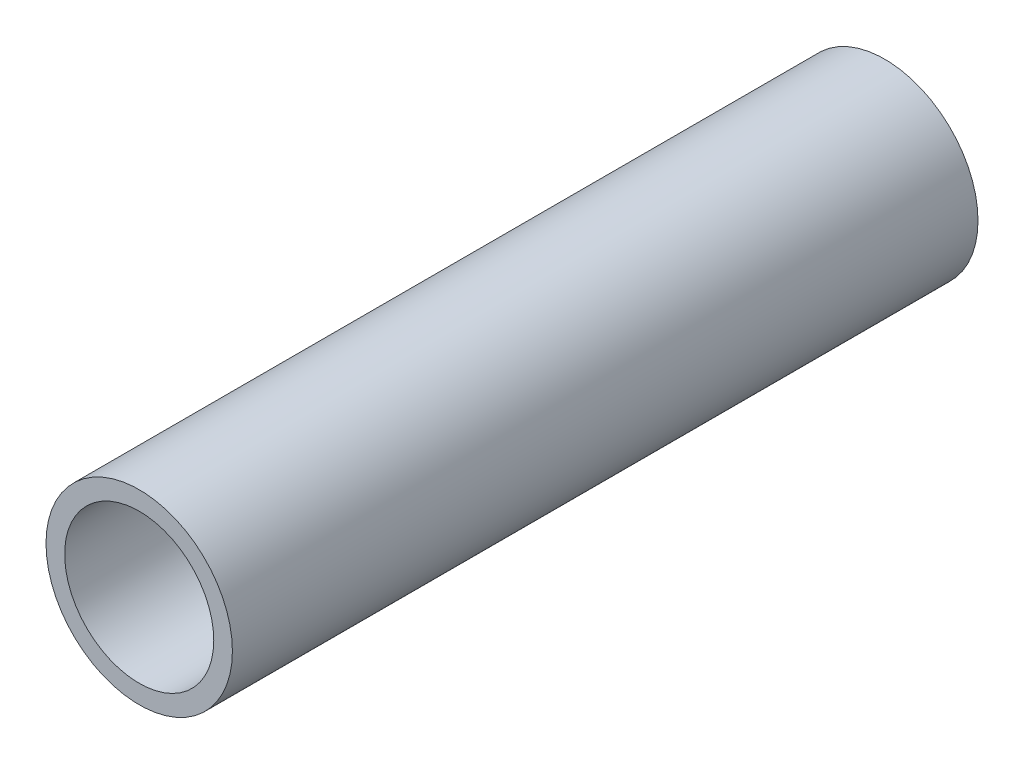
ISO-10303-21;
HEADER;
FILE_DESCRIPTION(('STEP AP214'),'2;1');
FILE_NAME('part.step','',(''),(''),'','','');
FILE_SCHEMA(('AUTOMOTIVE_DESIGN { 1 0 10303 214 1 1 1 1 }'));
ENDSEC;
DATA;
#1=APPLICATION_CONTEXT('core data for automotive mechanical design processes');
#2=APPLICATION_PROTOCOL_DEFINITION('international standard','automotive_design',2000,#1);
#3=PRODUCT_CONTEXT('',#1,'mechanical');
#4=PRODUCT('Part','Part','',(#3));
#5=PRODUCT_RELATED_PRODUCT_CATEGORY('part','',(#4));
#6=PRODUCT_DEFINITION_FORMATION('','',#4);
#7=PRODUCT_DEFINITION_CONTEXT('part definition',#1,'design');
#8=PRODUCT_DEFINITION('design','',#6,#7);
#9=PRODUCT_DEFINITION_SHAPE('','',#8);
#10=(LENGTH_UNIT() NAMED_UNIT(*) SI_UNIT(.MILLI.,.METRE.));
#11=(NAMED_UNIT(*) PLANE_ANGLE_UNIT() SI_UNIT($,.RADIAN.));
#12=(NAMED_UNIT(*) SI_UNIT($,.STERADIAN.) SOLID_ANGLE_UNIT());
#13=UNCERTAINTY_MEASURE_WITH_UNIT(LENGTH_MEASURE(1.E-05),#10,'distance_accuracy_value','');
#14=(GEOMETRIC_REPRESENTATION_CONTEXT(3) GLOBAL_UNCERTAINTY_ASSIGNED_CONTEXT((#13)) GLOBAL_UNIT_ASSIGNED_CONTEXT((#10,
#11,#12)) REPRESENTATION_CONTEXT('',''));
#15=CARTESIAN_POINT('',(0.,0.,0.));
#16=DIRECTION('',(0.,0.,1.));
#17=DIRECTION('',(1.,0.,0.));
#18=AXIS2_PLACEMENT_3D('',#15,#16,#17);
#19=CARTESIAN_POINT('',(0.,0.,40.));
#20=DIRECTION('',(0.,0.,1.));
#21=DIRECTION('',(1.,0.,0.));
#22=AXIS2_PLACEMENT_3D('',#19,#20,#21);
#23=PLANE('',#22);
#24=CARTESIAN_POINT('',(0.,0.,40.));
#25=DIRECTION('',(0.,0.,1.));
#26=DIRECTION('',(1.,0.,0.));
#27=AXIS2_PLACEMENT_3D('',#24,#25,#26);
#28=CIRCLE('',#27,5.);
#29=CARTESIAN_POINT('',(5.,0.,40.));
#30=VERTEX_POINT('',#29);
#31=EDGE_CURVE('E10',#30,#30,#28,.T.);
#32=ORIENTED_EDGE('',*,*,#31,.T.);
#33=EDGE_LOOP('',(#32));
#34=FACE_BOUND('',#33,.T.);
#35=CARTESIAN_POINT('',(0.,0.,40.));
#36=DIRECTION('',(0.,0.,1.));
#37=DIRECTION('',(1.,0.,0.));
#38=AXIS2_PLACEMENT_3D('',#35,#36,#37);
#39=CIRCLE('',#38,4.);
#40=CARTESIAN_POINT('',(4.,0.,40.));
#41=VERTEX_POINT('',#40);
#42=EDGE_CURVE('E42',#41,#41,#39,.T.);
#43=ORIENTED_EDGE('',*,*,#42,.F.);
#44=EDGE_LOOP('',(#43));
#45=FACE_BOUND('',#44,.T.);
#46=ADVANCED_FACE('F31',(#34,#45),#23,.T.);
#47=CARTESIAN_POINT('',(0.,0.,0.));
#48=DIRECTION('',(0.,0.,1.));
#49=DIRECTION('',(1.,0.,0.));
#50=AXIS2_PLACEMENT_3D('',#47,#48,#49);
#51=PLANE('',#50);
#52=CARTESIAN_POINT('',(0.,0.,0.));
#53=DIRECTION('',(0.,0.,1.));
#54=DIRECTION('',(1.,0.,0.));
#55=AXIS2_PLACEMENT_3D('',#52,#53,#54);
#56=CIRCLE('',#55,5.);
#57=CARTESIAN_POINT('',(5.,0.,0.));
#58=VERTEX_POINT('',#57);
#59=EDGE_CURVE('E35',#58,#58,#56,.T.);
#60=ORIENTED_EDGE('',*,*,#59,.F.);
#61=EDGE_LOOP('',(#60));
#62=FACE_BOUND('',#61,.T.);
#63=CARTESIAN_POINT('',(0.,0.,0.));
#64=DIRECTION('',(0.,0.,1.));
#65=DIRECTION('',(1.,0.,0.));
#66=AXIS2_PLACEMENT_3D('',#63,#64,#65);
#67=CIRCLE('',#66,4.);
#68=CARTESIAN_POINT('',(4.,0.,0.));
#69=VERTEX_POINT('',#68);
#70=EDGE_CURVE('E44',#69,#69,#67,.T.);
#71=ORIENTED_EDGE('',*,*,#70,.T.);
#72=EDGE_LOOP('',(#71));
#73=FACE_BOUND('',#72,.T.);
#74=ADVANCED_FACE('F54',(#62,#73),#51,.F.);
#75=CARTESIAN_POINT('',(0.,0.,40.));
#76=DIRECTION('',(0.,0.,-1.));
#77=DIRECTION('',(-1.,0.,0.));
#78=AXIS2_PLACEMENT_3D('',#75,#76,#77);
#79=CYLINDRICAL_SURFACE('',#78,5.);
#80=ORIENTED_EDGE('',*,*,#31,.F.);
#81=EDGE_LOOP('',(#80));
#82=FACE_BOUND('',#81,.T.);
#83=ORIENTED_EDGE('',*,*,#59,.T.);
#84=EDGE_LOOP('',(#83));
#85=FACE_BOUND('',#84,.T.);
#86=ADVANCED_FACE('F33',(#82,#85),#79,.T.);
#87=CARTESIAN_POINT('',(0.,0.,40.));
#88=DIRECTION('',(0.,0.,-1.));
#89=DIRECTION('',(-1.,0.,0.));
#90=AXIS2_PLACEMENT_3D('',#87,#88,#89);
#91=CYLINDRICAL_SURFACE('',#90,4.);
#92=ORIENTED_EDGE('',*,*,#42,.T.);
#93=EDGE_LOOP('',(#92));
#94=FACE_BOUND('',#93,.T.);
#95=ORIENTED_EDGE('',*,*,#70,.F.);
#96=EDGE_LOOP('',(#95));
#97=FACE_BOUND('',#96,.T.);
#98=ADVANCED_FACE('F50',(#94,#97),#91,.F.);
#99=CLOSED_SHELL('',(#46,#74,#86,#98));
#100=MANIFOLD_SOLID_BREP('B2',#99);
#101=ADVANCED_BREP_SHAPE_REPRESENTATION('',(#18,#100),#14);
#102=SHAPE_DEFINITION_REPRESENTATION(#9,#101);
ENDSEC;
END-ISO-10303-21;
